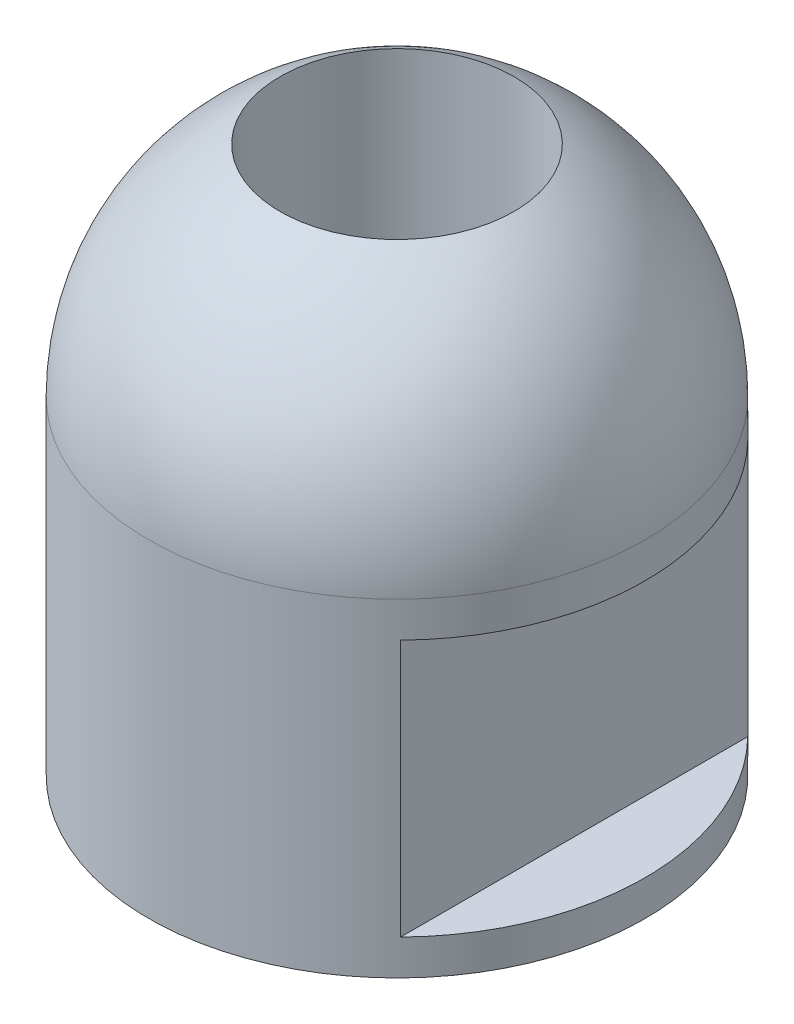
ISO-10303-21;
HEADER;
FILE_DESCRIPTION(('STEP AP214'),'2;1');
FILE_NAME('part.step','',(''),(''),'','','');
FILE_SCHEMA(('AUTOMOTIVE_DESIGN { 1 0 10303 214 1 1 1 1 }'));
ENDSEC;
DATA;
#1=APPLICATION_CONTEXT('core data for automotive mechanical design processes');
#2=APPLICATION_PROTOCOL_DEFINITION('international standard','automotive_design',2000,#1);
#3=PRODUCT_CONTEXT('',#1,'mechanical');
#4=PRODUCT('Part','Part','',(#3));
#5=PRODUCT_RELATED_PRODUCT_CATEGORY('part','',(#4));
#6=PRODUCT_DEFINITION_FORMATION('','',#4);
#7=PRODUCT_DEFINITION_CONTEXT('part definition',#1,'design');
#8=PRODUCT_DEFINITION('design','',#6,#7);
#9=PRODUCT_DEFINITION_SHAPE('','',#8);
#10=(LENGTH_UNIT() NAMED_UNIT(*) SI_UNIT(.MILLI.,.METRE.));
#11=(NAMED_UNIT(*) PLANE_ANGLE_UNIT() SI_UNIT($,.RADIAN.));
#12=(NAMED_UNIT(*) SI_UNIT($,.STERADIAN.) SOLID_ANGLE_UNIT());
#13=UNCERTAINTY_MEASURE_WITH_UNIT(LENGTH_MEASURE(1.E-05),#10,'distance_accuracy_value','');
#14=(GEOMETRIC_REPRESENTATION_CONTEXT(3) GLOBAL_UNCERTAINTY_ASSIGNED_CONTEXT((#13)) GLOBAL_UNIT_ASSIGNED_CONTEXT((#10,
#11,#12)) REPRESENTATION_CONTEXT('',''));
#15=CARTESIAN_POINT('',(0.,0.,0.));
#16=DIRECTION('',(0.,0.,1.));
#17=DIRECTION('',(1.,0.,0.));
#18=AXIS2_PLACEMENT_3D('',#15,#16,#17);
#19=CARTESIAN_POINT('',(0.,0.,0.));
#20=DIRECTION('',(0.,-1.,0.));
#21=DIRECTION('',(0.,0.,-1.));
#22=AXIS2_PLACEMENT_3D('',#19,#20,#21);
#23=PLANE('',#22);
#24=CARTESIAN_POINT('',(0.,0.,0.));
#25=DIRECTION('',(0.,-1.,0.));
#26=DIRECTION('',(0.,0.,-1.));
#27=AXIS2_PLACEMENT_3D('',#24,#25,#26);
#28=CIRCLE('',#27,1.64999999999999);
#29=CARTESIAN_POINT('',(0.,0.,-1.64999999999999));
#30=VERTEX_POINT('',#29);
#31=EDGE_CURVE('E110',#30,#30,#28,.T.);
#32=ORIENTED_EDGE('',*,*,#31,.F.);
#33=EDGE_LOOP('',(#32));
#34=FACE_BOUND('',#33,.T.);
#35=CARTESIAN_POINT('',(0.,0.,0.));
#36=DIRECTION('',(0.,-1.,0.));
#37=DIRECTION('',(0.,0.,-1.));
#38=AXIS2_PLACEMENT_3D('',#35,#36,#37);
#39=CIRCLE('',#38,3.5);
#40=CARTESIAN_POINT('',(0.,0.,-3.5));
#41=VERTEX_POINT('',#40);
#42=EDGE_CURVE('E86',#41,#41,#39,.T.);
#43=ORIENTED_EDGE('',*,*,#42,.T.);
#44=EDGE_LOOP('',(#43));
#45=FACE_BOUND('',#44,.T.);
#46=ADVANCED_FACE('F39',(#34,#45),#23,.T.);
#47=CARTESIAN_POINT('',(0.,8.12771867673099,0.));
#48=DIRECTION('',(0.,-1.,0.));
#49=DIRECTION('',(0.,0.,-1.));
#50=AXIS2_PLACEMENT_3D('',#47,#48,#49);
#51=CYLINDRICAL_SURFACE('',#50,3.5);
#52=DIRECTION('',(0.,-1.,0.));
#53=VECTOR('',#52,1.);
#54=CARTESIAN_POINT('',(2.5,8.12771867673099,-2.44948974278318));
#55=LINE('',#54,#53);
#56=CARTESIAN_POINT('',(2.5,0.500000000000002,-2.44948974278318));
#57=VERTEX_POINT('',#56);
#58=CARTESIAN_POINT('',(2.5,4.12771867673099,-2.44948974278318));
#59=VERTEX_POINT('',#58);
#60=EDGE_CURVE('E46',#57,#59,#55,.F.);
#61=ORIENTED_EDGE('',*,*,#60,.F.);
#62=CARTESIAN_POINT('',(0.,0.500000000000002,0.));
#63=DIRECTION('',(0.,-1.,0.));
#64=DIRECTION('',(1.,0.,0.));
#65=AXIS2_PLACEMENT_3D('',#62,#63,#64);
#66=CIRCLE('',#65,3.5);
#67=CARTESIAN_POINT('',(2.5,0.500000000000002,2.44948974278318));
#68=VERTEX_POINT('',#67);
#69=EDGE_CURVE('E11',#68,#57,#66,.F.);
#70=ORIENTED_EDGE('',*,*,#69,.F.);
#71=DIRECTION('',(0.,-1.,0.));
#72=VECTOR('',#71,1.);
#73=CARTESIAN_POINT('',(2.5,8.12771867673099,2.44948974278318));
#74=LINE('',#73,#72);
#75=CARTESIAN_POINT('',(2.5,4.12771867673099,2.44948974278318));
#76=VERTEX_POINT('',#75);
#77=EDGE_CURVE('E52',#76,#68,#74,.T.);
#78=ORIENTED_EDGE('',*,*,#77,.F.);
#79=CARTESIAN_POINT('',(0.,4.12771867673099,0.));
#80=DIRECTION('',(0.,1.,0.));
#81=DIRECTION('',(0.,0.,1.));
#82=AXIS2_PLACEMENT_3D('',#79,#80,#81);
#83=CIRCLE('',#82,3.5);
#84=EDGE_CURVE('E96',#59,#76,#83,.F.);
#85=ORIENTED_EDGE('',*,*,#84,.F.);
#86=EDGE_LOOP('',(#61,#70,#78,#85));
#87=FACE_BOUND('',#86,.T.);
#88=CARTESIAN_POINT('',(0.,0.500000000000002,0.));
#89=DIRECTION('',(0.,-1.,0.));
#90=DIRECTION('',(1.,0.,0.));
#91=AXIS2_PLACEMENT_3D('',#88,#89,#90);
#92=CIRCLE('',#91,3.5);
#93=CARTESIAN_POINT('',(-2.5,0.500000000000002,-2.44948974278318));
#94=VERTEX_POINT('',#93);
#95=CARTESIAN_POINT('',(-2.5,0.500000000000002,2.44948974278318));
#96=VERTEX_POINT('',#95);
#97=EDGE_CURVE('E77',#94,#96,#92,.F.);
#98=ORIENTED_EDGE('',*,*,#97,.F.);
#99=DIRECTION('',(0.,-1.,0.));
#100=VECTOR('',#99,1.);
#101=CARTESIAN_POINT('',(-2.5,8.12771867673099,-2.44948974278318));
#102=LINE('',#101,#100);
#103=CARTESIAN_POINT('',(-2.5,4.12771867673099,-2.44948974278318));
#104=VERTEX_POINT('',#103);
#105=EDGE_CURVE('E84',#104,#94,#102,.T.);
#106=ORIENTED_EDGE('',*,*,#105,.F.);
#107=CARTESIAN_POINT('',(0.,4.12771867673099,0.));
#108=DIRECTION('',(0.,1.,0.));
#109=DIRECTION('',(0.,0.,1.));
#110=AXIS2_PLACEMENT_3D('',#107,#108,#109);
#111=CIRCLE('',#110,3.5);
#112=CARTESIAN_POINT('',(-2.5,4.12771867673099,2.44948974278318));
#113=VERTEX_POINT('',#112);
#114=EDGE_CURVE('E100',#113,#104,#111,.F.);
#115=ORIENTED_EDGE('',*,*,#114,.F.);
#116=DIRECTION('',(0.,-1.,0.));
#117=VECTOR('',#116,1.);
#118=CARTESIAN_POINT('',(-2.5,8.12771867673099,2.44948974278318));
#119=LINE('',#118,#117);
#120=EDGE_CURVE('E81',#96,#113,#119,.F.);
#121=ORIENTED_EDGE('',*,*,#120,.F.);
#122=EDGE_LOOP('',(#98,#106,#115,#121));
#123=FACE_BOUND('',#122,.T.);
#124=CARTESIAN_POINT('',(0.,4.62771867673099,0.));
#125=DIRECTION('',(0.,-1.,0.));
#126=DIRECTION('',(0.,0.,-1.));
#127=AXIS2_PLACEMENT_3D('',#124,#125,#126);
#128=CIRCLE('',#127,3.5);
#129=CARTESIAN_POINT('',(0.,4.62771867673099,-3.5));
#130=VERTEX_POINT('',#129);
#131=EDGE_CURVE('E112',#130,#130,#128,.T.);
#132=ORIENTED_EDGE('',*,*,#131,.T.);
#133=EDGE_LOOP('',(#132));
#134=FACE_BOUND('',#133,.T.);
#135=ORIENTED_EDGE('',*,*,#42,.F.);
#136=EDGE_LOOP('',(#135));
#137=FACE_BOUND('',#136,.T.);
#138=ADVANCED_FACE('F76',(#87,#123,#134,#137),#51,.T.);
#139=CARTESIAN_POINT('',(0.,4.62771867673099,0.));
#140=DIRECTION('',(0.,-1.,0.));
#141=DIRECTION('',(1.,0.,0.));
#142=AXIS2_PLACEMENT_3D('',#139,#140,#141);
#143=SPHERICAL_SURFACE('',#142,3.5);
#144=CARTESIAN_POINT('',(0.,7.71438354354112,0.));
#145=DIRECTION('',(0.,-1.,0.));
#146=DIRECTION('',(0.,0.,-1.));
#147=AXIS2_PLACEMENT_3D('',#144,#145,#146);
#148=CIRCLE('',#147,1.64999999999999);
#149=CARTESIAN_POINT('',(0.,7.71438354354112,-1.64999999999999));
#150=VERTEX_POINT('',#149);
#151=EDGE_CURVE('E109',#150,#150,#148,.F.);
#152=ORIENTED_EDGE('',*,*,#151,.F.);
#153=EDGE_LOOP('',(#152));
#154=FACE_BOUND('',#153,.T.);
#155=ORIENTED_EDGE('',*,*,#131,.F.);
#156=EDGE_LOOP('',(#155));
#157=FACE_BOUND('',#156,.T.);
#158=ADVANCED_FACE('F129',(#154,#157),#143,.T.);
#159=CARTESIAN_POINT('',(0.,0.,0.));
#160=DIRECTION('',(0.,-1.,0.));
#161=DIRECTION('',(0.,0.,-1.));
#162=AXIS2_PLACEMENT_3D('',#159,#160,#161);
#163=CYLINDRICAL_SURFACE('',#162,1.64999999999999);
#164=ORIENTED_EDGE('',*,*,#151,.T.);
#165=EDGE_LOOP('',(#164));
#166=FACE_BOUND('',#165,.T.);
#167=ORIENTED_EDGE('',*,*,#31,.T.);
#168=EDGE_LOOP('',(#167));
#169=FACE_BOUND('',#168,.T.);
#170=ADVANCED_FACE('F131',(#166,#169),#163,.F.);
#171=CARTESIAN_POINT('',(-2.5,4.12771867673099,-3.5));
#172=DIRECTION('',(0.,1.,0.));
#173=DIRECTION('',(0.,0.,1.));
#174=AXIS2_PLACEMENT_3D('',#171,#172,#173);
#175=PLANE('',#174);
#176=DIRECTION('',(0.,0.,1.));
#177=VECTOR('',#176,1.);
#178=CARTESIAN_POINT('',(-2.5,4.12771867673099,-3.5));
#179=LINE('',#178,#177);
#180=EDGE_CURVE('E92',#104,#113,#179,.T.);
#181=ORIENTED_EDGE('',*,*,#180,.T.);
#182=ORIENTED_EDGE('',*,*,#114,.T.);
#183=EDGE_LOOP('',(#181,#182));
#184=FACE_BOUND('',#183,.T.);
#185=ADVANCED_FACE('F142',(#184),#175,.F.);
#186=CARTESIAN_POINT('',(-2.5,0.500000000000002,-3.5));
#187=DIRECTION('',(1.,0.,0.));
#188=DIRECTION('',(0.,0.,-1.));
#189=AXIS2_PLACEMENT_3D('',#186,#187,#188);
#190=PLANE('',#189);
#191=ORIENTED_EDGE('',*,*,#120,.T.);
#192=ORIENTED_EDGE('',*,*,#180,.F.);
#193=ORIENTED_EDGE('',*,*,#105,.T.);
#194=DIRECTION('',(0.,0.,1.));
#195=VECTOR('',#194,1.);
#196=CARTESIAN_POINT('',(-2.5,0.500000000000002,-3.5));
#197=LINE('',#196,#195);
#198=EDGE_CURVE('E91',#94,#96,#197,.T.);
#199=ORIENTED_EDGE('',*,*,#198,.T.);
#200=EDGE_LOOP('',(#191,#192,#193,#199));
#201=FACE_BOUND('',#200,.T.);
#202=ADVANCED_FACE('F95',(#201),#190,.F.);
#203=CARTESIAN_POINT('',(-3.5,0.500000000000002,-3.5));
#204=DIRECTION('',(0.,-1.,0.));
#205=DIRECTION('',(1.,0.,0.));
#206=AXIS2_PLACEMENT_3D('',#203,#204,#205);
#207=PLANE('',#206);
#208=ORIENTED_EDGE('',*,*,#198,.F.);
#209=ORIENTED_EDGE('',*,*,#97,.T.);
#210=EDGE_LOOP('',(#208,#209));
#211=FACE_BOUND('',#210,.T.);
#212=ADVANCED_FACE('F97',(#211),#207,.F.);
#213=CARTESIAN_POINT('',(3.5,0.500000000000002,-3.5));
#214=DIRECTION('',(0.,-1.,0.));
#215=DIRECTION('',(1.,0.,0.));
#216=AXIS2_PLACEMENT_3D('',#213,#214,#215);
#217=PLANE('',#216);
#218=ORIENTED_EDGE('',*,*,#69,.T.);
#219=DIRECTION('',(0.,0.,1.));
#220=VECTOR('',#219,1.);
#221=CARTESIAN_POINT('',(2.5,0.500000000000002,-3.5));
#222=LINE('',#221,#220);
#223=EDGE_CURVE('E105',#57,#68,#222,.T.);
#224=ORIENTED_EDGE('',*,*,#223,.T.);
#225=EDGE_LOOP('',(#218,#224));
#226=FACE_BOUND('',#225,.T.);
#227=ADVANCED_FACE('F146',(#226),#217,.F.);
#228=CARTESIAN_POINT('',(2.5,0.500000000000002,-3.5));
#229=DIRECTION('',(-1.,0.,0.));
#230=DIRECTION('',(0.,0.,1.));
#231=AXIS2_PLACEMENT_3D('',#228,#229,#230);
#232=PLANE('',#231);
#233=ORIENTED_EDGE('',*,*,#60,.T.);
#234=DIRECTION('',(0.,0.,1.));
#235=VECTOR('',#234,1.);
#236=CARTESIAN_POINT('',(2.5,4.12771867673099,-3.5));
#237=LINE('',#236,#235);
#238=EDGE_CURVE('E99',#59,#76,#237,.T.);
#239=ORIENTED_EDGE('',*,*,#238,.T.);
#240=ORIENTED_EDGE('',*,*,#77,.T.);
#241=ORIENTED_EDGE('',*,*,#223,.F.);
#242=EDGE_LOOP('',(#233,#239,#240,#241));
#243=FACE_BOUND('',#242,.T.);
#244=ADVANCED_FACE('F121',(#243),#232,.F.);
#245=CARTESIAN_POINT('',(2.5,4.12771867673099,-3.5));
#246=DIRECTION('',(0.,1.,0.));
#247=DIRECTION('',(0.,0.,1.));
#248=AXIS2_PLACEMENT_3D('',#245,#246,#247);
#249=PLANE('',#248);
#250=ORIENTED_EDGE('',*,*,#238,.F.);
#251=ORIENTED_EDGE('',*,*,#84,.T.);
#252=EDGE_LOOP('',(#250,#251));
#253=FACE_BOUND('',#252,.T.);
#254=ADVANCED_FACE('F130',(#253),#249,.F.);
#255=CLOSED_SHELL('',(#46,#138,#158,#170,#185,#202,#212,#227,#244,#254));
#256=MANIFOLD_SOLID_BREP('B2',#255);
#257=ADVANCED_BREP_SHAPE_REPRESENTATION('',(#18,#256),#14);
#258=SHAPE_DEFINITION_REPRESENTATION(#9,#257);
ENDSEC;
END-ISO-10303-21;
